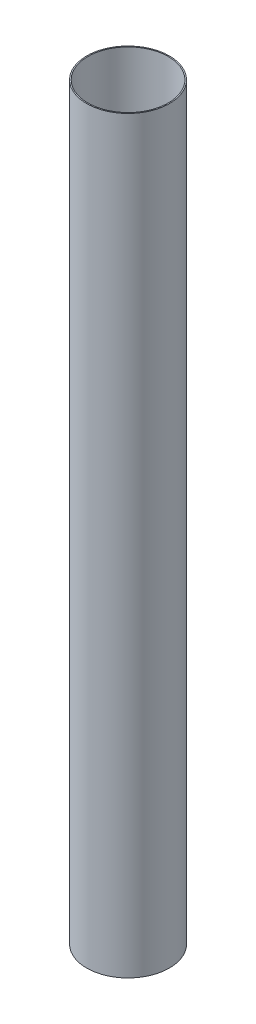
ISO-10303-21;
HEADER;
FILE_DESCRIPTION(('STEP AP214'),'2;1');
FILE_NAME('part.step','',(''),(''),'','','');
FILE_SCHEMA(('AUTOMOTIVE_DESIGN { 1 0 10303 214 1 1 1 1 }'));
ENDSEC;
DATA;
#1=APPLICATION_CONTEXT('core data for automotive mechanical design processes');
#2=APPLICATION_PROTOCOL_DEFINITION('international standard','automotive_design',2000,#1);
#3=PRODUCT_CONTEXT('',#1,'mechanical');
#4=PRODUCT('Part','Part','',(#3));
#5=PRODUCT_RELATED_PRODUCT_CATEGORY('part','',(#4));
#6=PRODUCT_DEFINITION_FORMATION('','',#4);
#7=PRODUCT_DEFINITION_CONTEXT('part definition',#1,'design');
#8=PRODUCT_DEFINITION('design','',#6,#7);
#9=PRODUCT_DEFINITION_SHAPE('','',#8);
#10=(LENGTH_UNIT() NAMED_UNIT(*) SI_UNIT(.MILLI.,.METRE.));
#11=(NAMED_UNIT(*) PLANE_ANGLE_UNIT() SI_UNIT($,.RADIAN.));
#12=(NAMED_UNIT(*) SI_UNIT($,.STERADIAN.) SOLID_ANGLE_UNIT());
#13=UNCERTAINTY_MEASURE_WITH_UNIT(LENGTH_MEASURE(1.E-05),#10,'distance_accuracy_value','');
#14=(GEOMETRIC_REPRESENTATION_CONTEXT(3) GLOBAL_UNCERTAINTY_ASSIGNED_CONTEXT((#13)) GLOBAL_UNIT_ASSIGNED_CONTEXT((#10,
#11,#12)) REPRESENTATION_CONTEXT('',''));
#15=CARTESIAN_POINT('',(0.,0.,0.));
#16=DIRECTION('',(0.,0.,1.));
#17=DIRECTION('',(1.,0.,0.));
#18=AXIS2_PLACEMENT_3D('',#15,#16,#17);
#19=CARTESIAN_POINT('',(0.,1270.,0.));
#20=DIRECTION('',(0.,1.,0.));
#21=DIRECTION('',(0.,0.,1.));
#22=AXIS2_PLACEMENT_3D('',#19,#20,#21);
#23=PLANE('',#22);
#24=CARTESIAN_POINT('',(0.,1270.,0.));
#25=DIRECTION('',(0.,1.,0.));
#26=DIRECTION('',(0.,0.,1.));
#27=AXIS2_PLACEMENT_3D('',#24,#25,#26);
#28=CIRCLE('',#27,70.1675);
#29=CARTESIAN_POINT('',(0.,1270.,-70.1675));
#30=VERTEX_POINT('',#29);
#31=EDGE_CURVE('E10',#30,#30,#28,.T.);
#32=ORIENTED_EDGE('',*,*,#31,.T.);
#33=EDGE_LOOP('',(#32));
#34=FACE_BOUND('',#33,.T.);
#35=CARTESIAN_POINT('',(0.,1270.,0.));
#36=DIRECTION('',(0.,1.,0.));
#37=DIRECTION('',(0.,0.,1.));
#38=AXIS2_PLACEMENT_3D('',#35,#36,#37);
#39=CIRCLE('',#38,68.2625);
#40=CARTESIAN_POINT('',(0.,1270.,-68.2625));
#41=VERTEX_POINT('',#40);
#42=EDGE_CURVE('E41',#41,#41,#39,.T.);
#43=ORIENTED_EDGE('',*,*,#42,.F.);
#44=EDGE_LOOP('',(#43));
#45=FACE_BOUND('',#44,.T.);
#46=ADVANCED_FACE('F30',(#34,#45),#23,.T.);
#47=CARTESIAN_POINT('',(0.,0.,0.));
#48=DIRECTION('',(0.,1.,0.));
#49=DIRECTION('',(0.,0.,1.));
#50=AXIS2_PLACEMENT_3D('',#47,#48,#49);
#51=PLANE('',#50);
#52=CARTESIAN_POINT('',(0.,0.,0.));
#53=DIRECTION('',(0.,1.,0.));
#54=DIRECTION('',(0.,0.,1.));
#55=AXIS2_PLACEMENT_3D('',#52,#53,#54);
#56=CIRCLE('',#55,70.1675);
#57=CARTESIAN_POINT('',(0.,-2.22044604925031E-13,-70.1675));
#58=VERTEX_POINT('',#57);
#59=EDGE_CURVE('E34',#58,#58,#56,.T.);
#60=ORIENTED_EDGE('',*,*,#59,.F.);
#61=EDGE_LOOP('',(#60));
#62=FACE_BOUND('',#61,.T.);
#63=CARTESIAN_POINT('',(0.,0.,0.));
#64=DIRECTION('',(0.,1.,0.));
#65=DIRECTION('',(0.,0.,1.));
#66=AXIS2_PLACEMENT_3D('',#63,#64,#65);
#67=CIRCLE('',#66,68.2625);
#68=CARTESIAN_POINT('',(0.,-2.22044604925031E-13,-68.2625));
#69=VERTEX_POINT('',#68);
#70=EDGE_CURVE('E43',#69,#69,#67,.T.);
#71=ORIENTED_EDGE('',*,*,#70,.T.);
#72=EDGE_LOOP('',(#71));
#73=FACE_BOUND('',#72,.T.);
#74=ADVANCED_FACE('F53',(#62,#73),#51,.F.);
#75=CARTESIAN_POINT('',(0.,1270.,0.));
#76=DIRECTION('',(0.,-1.,0.));
#77=DIRECTION('',(0.,0.,-1.));
#78=AXIS2_PLACEMENT_3D('',#75,#76,#77);
#79=CYLINDRICAL_SURFACE('',#78,70.1675);
#80=CARTESIAN_POINT('',(0.,1270.,-70.1675));
#81=CARTESIAN_POINT('',(0.,1256.77083333333,-70.1675));
#82=CARTESIAN_POINT('',(0.,1243.54166666667,-70.1675));
#83=CARTESIAN_POINT('',(0.,1217.08333333333,-70.1675));
#84=CARTESIAN_POINT('',(0.,1203.85416666667,-70.1675));
#85=CARTESIAN_POINT('',(0.,1177.39583333333,-70.1675));
#86=CARTESIAN_POINT('',(0.,1164.16666666667,-70.1675));
#87=CARTESIAN_POINT('',(0.,1137.70833333333,-70.1675));
#88=CARTESIAN_POINT('',(0.,1124.47916666667,-70.1675));
#89=CARTESIAN_POINT('',(0.,1098.02083333333,-70.1675));
#90=CARTESIAN_POINT('',(0.,1084.79166666667,-70.1675));
#91=CARTESIAN_POINT('',(0.,1058.33333333333,-70.1675));
#92=CARTESIAN_POINT('',(0.,1045.10416666667,-70.1675));
#93=CARTESIAN_POINT('',(0.,1018.64583333333,-70.1675));
#94=CARTESIAN_POINT('',(0.,1005.41666666667,-70.1675));
#95=CARTESIAN_POINT('',(0.,978.958333333333,-70.1675));
#96=CARTESIAN_POINT('',(0.,965.729166666667,-70.1675));
#97=CARTESIAN_POINT('',(0.,939.270833333333,-70.1675));
#98=CARTESIAN_POINT('',(0.,926.041666666667,-70.1675));
#99=CARTESIAN_POINT('',(0.,899.583333333333,-70.1675));
#100=CARTESIAN_POINT('',(0.,886.354166666666,-70.1675));
#101=CARTESIAN_POINT('',(0.,859.895833333333,-70.1675));
#102=CARTESIAN_POINT('',(0.,846.666666666666,-70.1675));
#103=CARTESIAN_POINT('',(0.,820.208333333333,-70.1675));
#104=CARTESIAN_POINT('',(0.,806.979166666667,-70.1675));
#105=CARTESIAN_POINT('',(0.,780.520833333333,-70.1675));
#106=CARTESIAN_POINT('',(0.,767.291666666667,-70.1675));
#107=CARTESIAN_POINT('',(0.,740.833333333333,-70.1675));
#108=CARTESIAN_POINT('',(0.,727.604166666667,-70.1675));
#109=CARTESIAN_POINT('',(0.,701.145833333333,-70.1675));
#110=CARTESIAN_POINT('',(0.,687.916666666666,-70.1675));
#111=CARTESIAN_POINT('',(0.,661.458333333333,-70.1675));
#112=CARTESIAN_POINT('',(0.,648.229166666666,-70.1675));
#113=CARTESIAN_POINT('',(0.,621.770833333333,-70.1675));
#114=CARTESIAN_POINT('',(0.,608.541666666666,-70.1675));
#115=CARTESIAN_POINT('',(0.,582.083333333333,-70.1675));
#116=CARTESIAN_POINT('',(0.,568.854166666666,-70.1675));
#117=CARTESIAN_POINT('',(0.,542.395833333333,-70.1675));
#118=CARTESIAN_POINT('',(0.,529.166666666666,-70.1675));
#119=CARTESIAN_POINT('',(0.,502.708333333333,-70.1675));
#120=CARTESIAN_POINT('',(0.,489.479166666666,-70.1675));
#121=CARTESIAN_POINT('',(0.,463.020833333333,-70.1675));
#122=CARTESIAN_POINT('',(0.,449.791666666666,-70.1675));
#123=CARTESIAN_POINT('',(0.,423.333333333333,-70.1675));
#124=CARTESIAN_POINT('',(0.,410.104166666666,-70.1675));
#125=CARTESIAN_POINT('',(0.,383.645833333333,-70.1675));
#126=CARTESIAN_POINT('',(0.,370.416666666666,-70.1675));
#127=CARTESIAN_POINT('',(0.,343.958333333333,-70.1675));
#128=CARTESIAN_POINT('',(0.,330.729166666666,-70.1675));
#129=CARTESIAN_POINT('',(0.,304.270833333333,-70.1675));
#130=CARTESIAN_POINT('',(0.,291.041666666666,-70.1675));
#131=CARTESIAN_POINT('',(0.,264.583333333333,-70.1675));
#132=CARTESIAN_POINT('',(0.,251.354166666666,-70.1675));
#133=CARTESIAN_POINT('',(0.,224.895833333333,-70.1675));
#134=CARTESIAN_POINT('',(0.,211.666666666667,-70.1675));
#135=CARTESIAN_POINT('',(0.,185.208333333333,-70.1675));
#136=CARTESIAN_POINT('',(0.,171.979166666666,-70.1675));
#137=CARTESIAN_POINT('',(0.,145.520833333333,-70.1675));
#138=CARTESIAN_POINT('',(0.,132.291666666666,-70.1675));
#139=CARTESIAN_POINT('',(0.,105.833333333333,-70.1675));
#140=CARTESIAN_POINT('',(0.,92.6041666666664,-70.1675));
#141=CARTESIAN_POINT('',(0.,66.1458333333331,-70.1675));
#142=CARTESIAN_POINT('',(0.,52.9166666666665,-70.1675));
#143=CARTESIAN_POINT('',(0.,26.4583333333332,-70.1675));
#144=CARTESIAN_POINT('',(0.,13.2291666666665,-70.1675));
#145=CARTESIAN_POINT('',(0.,-2.22044604925031E-13,-70.1675));
#146=B_SPLINE_CURVE_WITH_KNOTS('',3,(#80,#81,#82,#83,#84,#85,#86,#87,#88,#89,#90,#91,#92,#93,
#94,#95,#96,#97,#98,#99,#100,#101,#102,#103,#104,#105,#106,#107,#108,#109,#110,#111,#112,#113,
#114,#115,#116,#117,#118,#119,#120,#121,#122,#123,#124,#125,#126,#127,#128,#129,#130,#131,#132,
#133,#134,#135,#136,#137,#138,#139,#140,#141,#142,#143,#144,#145),.UNSPECIFIED.,.F.,.F.,(4,2,2,
2,2,2,2,2,2,2,2,2,2,2,2,2,2,2,2,2,2,2,2,2,2,2,2,2,2,2,2,2,4),(0.,39.6875000000001,
79.3750000000002,119.0625,158.75,198.4375,238.125,277.8125,317.5,357.1875,396.875,436.5625,
476.25,515.9375,555.625,595.3125,635.,674.6875,714.375,754.0625,793.75,833.4375,873.125,
912.8125,952.5,992.1875,1031.875,1071.5625,1111.25,1150.9375,1190.625,1230.3125,1270.),.UNSPECIFIED.);
#147=EDGE_CURVE('BSEAM32',#30,#58,#146,.T.);
#148=ORIENTED_EDGE('',*,*,#31,.F.);
#149=ORIENTED_EDGE('',*,*,#59,.T.);
#150=ORIENTED_EDGE('',*,*,#147,.T.);
#151=ORIENTED_EDGE('',*,*,#147,.F.);
#152=EDGE_LOOP('',(#148,#150,#149,#151));
#153=FACE_BOUND('',#152,.T.);
#154=ADVANCED_FACE('F32',(#153),#79,.T.);
#155=CARTESIAN_POINT('',(0.,1270.,0.));
#156=DIRECTION('',(0.,-1.,0.));
#157=DIRECTION('',(0.,0.,-1.));
#158=AXIS2_PLACEMENT_3D('',#155,#156,#157);
#159=CYLINDRICAL_SURFACE('',#158,68.2625);
#160=CARTESIAN_POINT('',(0.,1270.,-68.2625));
#161=CARTESIAN_POINT('',(0.,1256.77083333333,-68.2625));
#162=CARTESIAN_POINT('',(0.,1243.54166666667,-68.2625));
#163=CARTESIAN_POINT('',(0.,1217.08333333333,-68.2625));
#164=CARTESIAN_POINT('',(0.,1203.85416666667,-68.2625));
#165=CARTESIAN_POINT('',(0.,1177.39583333333,-68.2625));
#166=CARTESIAN_POINT('',(0.,1164.16666666667,-68.2625));
#167=CARTESIAN_POINT('',(0.,1137.70833333333,-68.2625));
#168=CARTESIAN_POINT('',(0.,1124.47916666667,-68.2625));
#169=CARTESIAN_POINT('',(0.,1098.02083333333,-68.2625));
#170=CARTESIAN_POINT('',(0.,1084.79166666667,-68.2625));
#171=CARTESIAN_POINT('',(0.,1058.33333333333,-68.2625));
#172=CARTESIAN_POINT('',(0.,1045.10416666667,-68.2625));
#173=CARTESIAN_POINT('',(0.,1018.64583333333,-68.2625));
#174=CARTESIAN_POINT('',(0.,1005.41666666667,-68.2625));
#175=CARTESIAN_POINT('',(0.,978.958333333333,-68.2625));
#176=CARTESIAN_POINT('',(0.,965.729166666667,-68.2625));
#177=CARTESIAN_POINT('',(0.,939.270833333333,-68.2625));
#178=CARTESIAN_POINT('',(0.,926.041666666667,-68.2625));
#179=CARTESIAN_POINT('',(0.,899.583333333333,-68.2625));
#180=CARTESIAN_POINT('',(0.,886.354166666666,-68.2625));
#181=CARTESIAN_POINT('',(0.,859.895833333333,-68.2625));
#182=CARTESIAN_POINT('',(0.,846.666666666666,-68.2625));
#183=CARTESIAN_POINT('',(0.,820.208333333333,-68.2625));
#184=CARTESIAN_POINT('',(0.,806.979166666667,-68.2625));
#185=CARTESIAN_POINT('',(0.,780.520833333333,-68.2625));
#186=CARTESIAN_POINT('',(0.,767.291666666667,-68.2625));
#187=CARTESIAN_POINT('',(0.,740.833333333333,-68.2625));
#188=CARTESIAN_POINT('',(0.,727.604166666667,-68.2625));
#189=CARTESIAN_POINT('',(0.,701.145833333333,-68.2625));
#190=CARTESIAN_POINT('',(0.,687.916666666666,-68.2625));
#191=CARTESIAN_POINT('',(0.,661.458333333333,-68.2625));
#192=CARTESIAN_POINT('',(0.,648.229166666666,-68.2625));
#193=CARTESIAN_POINT('',(0.,621.770833333333,-68.2625));
#194=CARTESIAN_POINT('',(0.,608.541666666666,-68.2625));
#195=CARTESIAN_POINT('',(0.,582.083333333333,-68.2625));
#196=CARTESIAN_POINT('',(0.,568.854166666666,-68.2625));
#197=CARTESIAN_POINT('',(0.,542.395833333333,-68.2625));
#198=CARTESIAN_POINT('',(0.,529.166666666666,-68.2625));
#199=CARTESIAN_POINT('',(0.,502.708333333333,-68.2625));
#200=CARTESIAN_POINT('',(0.,489.479166666666,-68.2625));
#201=CARTESIAN_POINT('',(0.,463.020833333333,-68.2625));
#202=CARTESIAN_POINT('',(0.,449.791666666666,-68.2625));
#203=CARTESIAN_POINT('',(0.,423.333333333333,-68.2625));
#204=CARTESIAN_POINT('',(0.,410.104166666666,-68.2625));
#205=CARTESIAN_POINT('',(0.,383.645833333333,-68.2625));
#206=CARTESIAN_POINT('',(0.,370.416666666666,-68.2625));
#207=CARTESIAN_POINT('',(0.,343.958333333333,-68.2625));
#208=CARTESIAN_POINT('',(0.,330.729166666666,-68.2625));
#209=CARTESIAN_POINT('',(0.,304.270833333333,-68.2625));
#210=CARTESIAN_POINT('',(0.,291.041666666666,-68.2625));
#211=CARTESIAN_POINT('',(0.,264.583333333333,-68.2625));
#212=CARTESIAN_POINT('',(0.,251.354166666666,-68.2625));
#213=CARTESIAN_POINT('',(0.,224.895833333333,-68.2625));
#214=CARTESIAN_POINT('',(0.,211.666666666667,-68.2625));
#215=CARTESIAN_POINT('',(0.,185.208333333333,-68.2625));
#216=CARTESIAN_POINT('',(0.,171.979166666666,-68.2625));
#217=CARTESIAN_POINT('',(0.,145.520833333333,-68.2625));
#218=CARTESIAN_POINT('',(0.,132.291666666666,-68.2625));
#219=CARTESIAN_POINT('',(0.,105.833333333333,-68.2625));
#220=CARTESIAN_POINT('',(0.,92.6041666666664,-68.2625));
#221=CARTESIAN_POINT('',(0.,66.1458333333331,-68.2625));
#222=CARTESIAN_POINT('',(0.,52.9166666666665,-68.2625));
#223=CARTESIAN_POINT('',(0.,26.4583333333332,-68.2625));
#224=CARTESIAN_POINT('',(0.,13.2291666666665,-68.2625));
#225=CARTESIAN_POINT('',(0.,-2.22044604925031E-13,-68.2625));
#226=B_SPLINE_CURVE_WITH_KNOTS('',3,(#160,#161,#162,#163,#164,#165,#166,#167,#168,#169,#170,
#171,#172,#173,#174,#175,#176,#177,#178,#179,#180,#181,#182,#183,#184,#185,#186,#187,#188,#189,
#190,#191,#192,#193,#194,#195,#196,#197,#198,#199,#200,#201,#202,#203,#204,#205,#206,#207,#208,
#209,#210,#211,#212,#213,#214,#215,#216,#217,#218,#219,#220,#221,#222,#223,#224,#225),
.UNSPECIFIED.,.F.,.F.,(4,2,2,2,2,2,2,2,2,2,2,2,2,2,2,2,2,2,2,2,2,2,2,2,2,2,2,2,2,2,2,2,4),(0.,
39.6875000000001,79.3750000000002,119.0625,158.75,198.4375,238.125,277.8125,317.5,357.1875,
396.875,436.5625,476.25,515.9375,555.625,595.3125,635.,674.6875,714.375,754.0625,793.75,
833.4375,873.125,912.8125,952.5,992.1875,1031.875,1071.5625,1111.25,1150.9375,1190.625,
1230.3125,1270.),.UNSPECIFIED.);
#227=EDGE_CURVE('BSEAM49',#41,#69,#226,.T.);
#228=ORIENTED_EDGE('',*,*,#42,.T.);
#229=ORIENTED_EDGE('',*,*,#70,.F.);
#230=ORIENTED_EDGE('',*,*,#227,.T.);
#231=ORIENTED_EDGE('',*,*,#227,.F.);
#232=EDGE_LOOP('',(#228,#230,#229,#231));
#233=FACE_BOUND('',#232,.T.);
#234=ADVANCED_FACE('F49',(#233),#159,.F.);
#235=CLOSED_SHELL('',(#46,#74,#154,#234));
#236=MANIFOLD_SOLID_BREP('B2',#235);
#237=ADVANCED_BREP_SHAPE_REPRESENTATION('',(#18,#236),#14);
#238=SHAPE_DEFINITION_REPRESENTATION(#9,#237);
ENDSEC;
END-ISO-10303-21;
